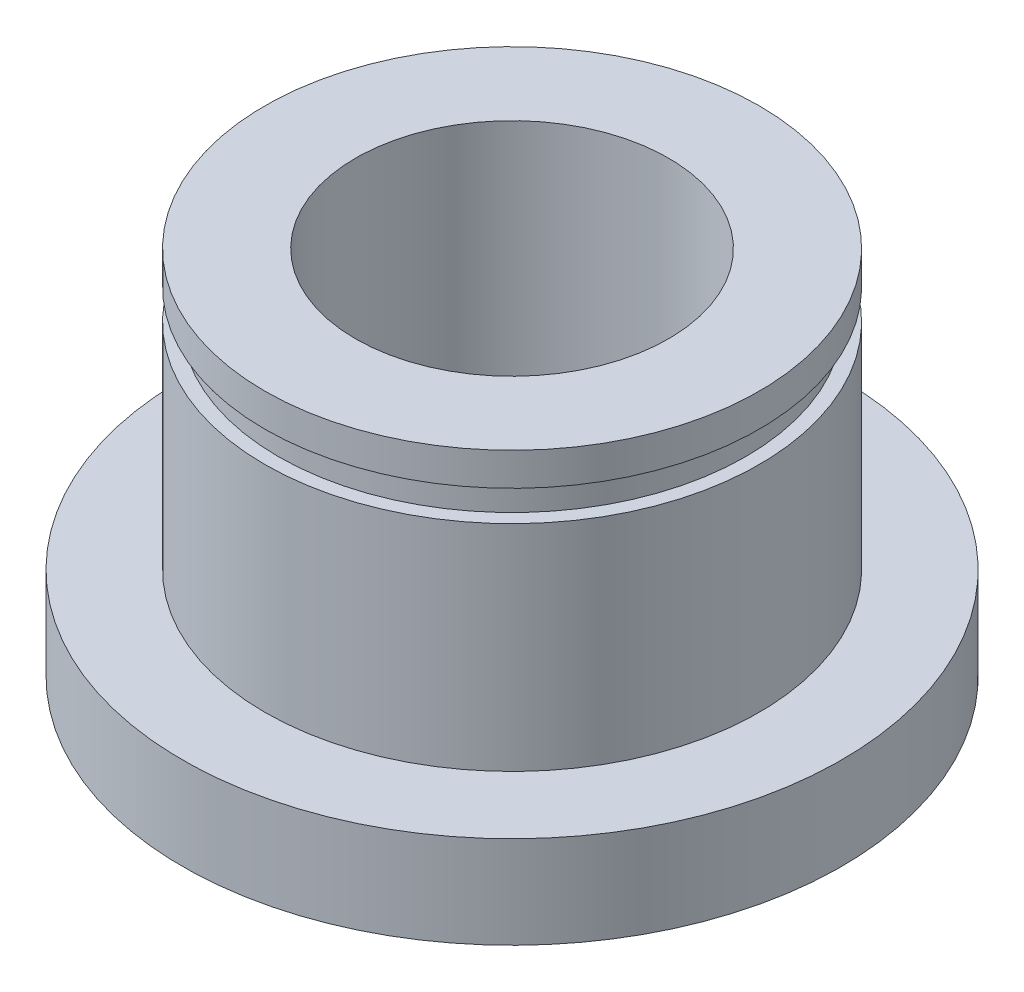
ISO-10303-21;
HEADER;
FILE_DESCRIPTION(('STEP AP214'),'2;1');
FILE_NAME('part.step','',(''),(''),'','','');
FILE_SCHEMA(('AUTOMOTIVE_DESIGN { 1 0 10303 214 1 1 1 1 }'));
ENDSEC;
DATA;
#1=APPLICATION_CONTEXT('core data for automotive mechanical design processes');
#2=APPLICATION_PROTOCOL_DEFINITION('international standard','automotive_design',2000,#1);
#3=PRODUCT_CONTEXT('',#1,'mechanical');
#4=PRODUCT('Part','Part','',(#3));
#5=PRODUCT_RELATED_PRODUCT_CATEGORY('part','',(#4));
#6=PRODUCT_DEFINITION_FORMATION('','',#4);
#7=PRODUCT_DEFINITION_CONTEXT('part definition',#1,'design');
#8=PRODUCT_DEFINITION('design','',#6,#7);
#9=PRODUCT_DEFINITION_SHAPE('','',#8);
#10=(LENGTH_UNIT() NAMED_UNIT(*) SI_UNIT(.MILLI.,.METRE.));
#11=(NAMED_UNIT(*) PLANE_ANGLE_UNIT() SI_UNIT($,.RADIAN.));
#12=(NAMED_UNIT(*) SI_UNIT($,.STERADIAN.) SOLID_ANGLE_UNIT());
#13=UNCERTAINTY_MEASURE_WITH_UNIT(LENGTH_MEASURE(1.E-05),#10,'distance_accuracy_value','');
#14=(GEOMETRIC_REPRESENTATION_CONTEXT(3) GLOBAL_UNCERTAINTY_ASSIGNED_CONTEXT((#13)) GLOBAL_UNIT_ASSIGNED_CONTEXT((#10,
#11,#12)) REPRESENTATION_CONTEXT('',''));
#15=CARTESIAN_POINT('',(0.,0.,0.));
#16=DIRECTION('',(0.,0.,1.));
#17=DIRECTION('',(1.,0.,0.));
#18=AXIS2_PLACEMENT_3D('',#15,#16,#17);
#19=CARTESIAN_POINT('',(0.,-4.460875,0.));
#20=DIRECTION('',(0.,1.,0.));
#21=DIRECTION('',(0.,0.,1.));
#22=AXIS2_PLACEMENT_3D('',#19,#20,#21);
#23=PLANE('',#22);
#24=CARTESIAN_POINT('',(0.,-4.460875,0.));
#25=DIRECTION('',(0.,1.,0.));
#26=DIRECTION('',(0.,0.,1.));
#27=AXIS2_PLACEMENT_3D('',#24,#25,#26);
#28=CIRCLE('',#27,4.564126);
#29=CARTESIAN_POINT('',(0.,-4.460875,4.564126));
#30=VERTEX_POINT('',#29);
#31=EDGE_CURVE('E50',#30,#30,#28,.T.);
#32=ORIENTED_EDGE('',*,*,#31,.T.);
#33=EDGE_LOOP('',(#32));
#34=FACE_BOUND('',#33,.T.);
#35=CARTESIAN_POINT('',(0.,-4.460875,0.));
#36=DIRECTION('',(0.,-1.,0.));
#37=DIRECTION('',(0.,0.,-1.));
#38=AXIS2_PLACEMENT_3D('',#35,#36,#37);
#39=CIRCLE('',#38,7.9375);
#40=CARTESIAN_POINT('',(0.,-4.460875,-7.9375));
#41=VERTEX_POINT('',#40);
#42=EDGE_CURVE('E56',#41,#41,#39,.T.);
#43=ORIENTED_EDGE('',*,*,#42,.T.);
#44=EDGE_LOOP('',(#43));
#45=FACE_BOUND('',#44,.T.);
#46=ADVANCED_FACE('F42',(#34,#45),#23,.F.);
#47=CARTESIAN_POINT('',(0.,0.,0.));
#48=DIRECTION('',(0.,-1.,0.));
#49=DIRECTION('',(0.,0.,-1.));
#50=AXIS2_PLACEMENT_3D('',#47,#48,#49);
#51=CYLINDRICAL_SURFACE('',#50,7.9375);
#52=ORIENTED_EDGE('',*,*,#42,.F.);
#53=EDGE_LOOP('',(#52));
#54=FACE_BOUND('',#53,.T.);
#55=CARTESIAN_POINT('',(0.,-2.238375,0.));
#56=DIRECTION('',(0.,-1.,0.));
#57=DIRECTION('',(0.,0.,-1.));
#58=AXIS2_PLACEMENT_3D('',#55,#56,#57);
#59=CIRCLE('',#58,7.9375);
#60=CARTESIAN_POINT('',(0.,-2.238375,-7.9375));
#61=VERTEX_POINT('',#60);
#62=EDGE_CURVE('E62',#61,#61,#59,.T.);
#63=ORIENTED_EDGE('',*,*,#62,.T.);
#64=EDGE_LOOP('',(#63));
#65=FACE_BOUND('',#64,.T.);
#66=ADVANCED_FACE('F119',(#54,#65),#51,.T.);
#67=CARTESIAN_POINT('',(0.,-2.238375,7.9375));
#68=DIRECTION('',(0.,-1.,0.));
#69=DIRECTION('',(0.,0.,-1.));
#70=AXIS2_PLACEMENT_3D('',#67,#68,#69);
#71=PLANE('',#70);
#72=ORIENTED_EDGE('',*,*,#62,.F.);
#73=EDGE_LOOP('',(#72));
#74=FACE_BOUND('',#73,.T.);
#75=CARTESIAN_POINT('',(0.,-2.238375,0.));
#76=DIRECTION('',(0.,-1.,0.));
#77=DIRECTION('',(0.,0.,-1.));
#78=AXIS2_PLACEMENT_3D('',#75,#76,#77);
#79=CIRCLE('',#78,5.953125);
#80=CARTESIAN_POINT('',(0.,-2.238375,-5.953125));
#81=VERTEX_POINT('',#80);
#82=EDGE_CURVE('E68',#81,#81,#79,.T.);
#83=ORIENTED_EDGE('',*,*,#82,.T.);
#84=EDGE_LOOP('',(#83));
#85=FACE_BOUND('',#84,.T.);
#86=ADVANCED_FACE('F123',(#74,#85),#71,.F.);
#87=CARTESIAN_POINT('',(0.,0.,0.));
#88=DIRECTION('',(0.,-1.,0.));
#89=DIRECTION('',(0.,0.,-1.));
#90=AXIS2_PLACEMENT_3D('',#87,#88,#89);
#91=CYLINDRICAL_SURFACE('',#90,5.953125);
#92=ORIENTED_EDGE('',*,*,#82,.F.);
#93=EDGE_LOOP('',(#92));
#94=FACE_BOUND('',#93,.T.);
#95=CARTESIAN_POINT('',(0.,2.930525,0.));
#96=DIRECTION('',(0.,-1.,0.));
#97=DIRECTION('',(0.,0.,-1.));
#98=AXIS2_PLACEMENT_3D('',#95,#96,#97);
#99=CIRCLE('',#98,5.953125);
#100=CARTESIAN_POINT('',(0.,2.930525,-5.953125));
#101=VERTEX_POINT('',#100);
#102=EDGE_CURVE('E72',#101,#101,#99,.T.);
#103=ORIENTED_EDGE('',*,*,#102,.T.);
#104=EDGE_LOOP('',(#103));
#105=FACE_BOUND('',#104,.T.);
#106=ADVANCED_FACE('F130',(#94,#105),#91,.T.);
#107=CARTESIAN_POINT('',(0.,2.930525,5.953125));
#108=DIRECTION('',(0.,-1.,0.));
#109=DIRECTION('',(0.,0.,-1.));
#110=AXIS2_PLACEMENT_3D('',#107,#108,#109);
#111=PLANE('',#110);
#112=ORIENTED_EDGE('',*,*,#102,.F.);
#113=EDGE_LOOP('',(#112));
#114=FACE_BOUND('',#113,.T.);
#115=CARTESIAN_POINT('',(0.,2.930525,0.));
#116=DIRECTION('',(0.,-1.,0.));
#117=DIRECTION('',(0.,0.,-1.));
#118=AXIS2_PLACEMENT_3D('',#115,#116,#117);
#119=CIRCLE('',#118,5.6261);
#120=CARTESIAN_POINT('',(0.,2.930525,-5.6261));
#121=VERTEX_POINT('',#120);
#122=EDGE_CURVE('E76',#121,#121,#119,.T.);
#123=ORIENTED_EDGE('',*,*,#122,.T.);
#124=EDGE_LOOP('',(#123));
#125=FACE_BOUND('',#124,.T.);
#126=ADVANCED_FACE('F134',(#114,#125),#111,.F.);
#127=CARTESIAN_POINT('',(0.,0.,0.));
#128=DIRECTION('',(0.,-1.,0.));
#129=DIRECTION('',(0.,0.,-1.));
#130=AXIS2_PLACEMENT_3D('',#127,#128,#129);
#131=CYLINDRICAL_SURFACE('',#130,5.6261);
#132=ORIENTED_EDGE('',*,*,#122,.F.);
#133=EDGE_LOOP('',(#132));
#134=FACE_BOUND('',#133,.T.);
#135=CARTESIAN_POINT('',(0.,3.667125,0.));
#136=DIRECTION('',(0.,-1.,0.));
#137=DIRECTION('',(0.,0.,-1.));
#138=AXIS2_PLACEMENT_3D('',#135,#136,#137);
#139=CIRCLE('',#138,5.6261);
#140=CARTESIAN_POINT('',(0.,3.667125,-5.6261));
#141=VERTEX_POINT('',#140);
#142=EDGE_CURVE('E80',#141,#141,#139,.T.);
#143=ORIENTED_EDGE('',*,*,#142,.T.);
#144=EDGE_LOOP('',(#143));
#145=FACE_BOUND('',#144,.T.);
#146=ADVANCED_FACE('F114',(#134,#145),#131,.T.);
#147=CARTESIAN_POINT('',(0.,3.667125,5.6261));
#148=DIRECTION('',(0.,1.,0.));
#149=DIRECTION('',(0.,0.,1.));
#150=AXIS2_PLACEMENT_3D('',#147,#148,#149);
#151=PLANE('',#150);
#152=ORIENTED_EDGE('',*,*,#142,.F.);
#153=EDGE_LOOP('',(#152));
#154=FACE_BOUND('',#153,.T.);
#155=CARTESIAN_POINT('',(0.,3.667125,0.));
#156=DIRECTION('',(0.,-1.,0.));
#157=DIRECTION('',(0.,0.,-1.));
#158=AXIS2_PLACEMENT_3D('',#155,#156,#157);
#159=CIRCLE('',#158,5.953125);
#160=CARTESIAN_POINT('',(0.,3.667125,-5.953125));
#161=VERTEX_POINT('',#160);
#162=EDGE_CURVE('E84',#161,#161,#159,.T.);
#163=ORIENTED_EDGE('',*,*,#162,.T.);
#164=EDGE_LOOP('',(#163));
#165=FACE_BOUND('',#164,.T.);
#166=ADVANCED_FACE('F108',(#154,#165),#151,.F.);
#167=CARTESIAN_POINT('',(0.,0.,0.));
#168=DIRECTION('',(0.,-1.,0.));
#169=DIRECTION('',(0.,0.,-1.));
#170=AXIS2_PLACEMENT_3D('',#167,#168,#169);
#171=CYLINDRICAL_SURFACE('',#170,5.953125);
#172=ORIENTED_EDGE('',*,*,#162,.F.);
#173=EDGE_LOOP('',(#172));
#174=FACE_BOUND('',#173,.T.);
#175=CARTESIAN_POINT('',(0.,4.460875,0.));
#176=DIRECTION('',(0.,-1.,0.));
#177=DIRECTION('',(0.,0.,-1.));
#178=AXIS2_PLACEMENT_3D('',#175,#176,#177);
#179=CIRCLE('',#178,5.953125);
#180=CARTESIAN_POINT('',(0.,4.460875,-5.953125));
#181=VERTEX_POINT('',#180);
#182=EDGE_CURVE('E88',#181,#181,#179,.T.);
#183=ORIENTED_EDGE('',*,*,#182,.T.);
#184=EDGE_LOOP('',(#183));
#185=FACE_BOUND('',#184,.T.);
#186=ADVANCED_FACE('F103',(#174,#185),#171,.T.);
#187=CARTESIAN_POINT('',(0.,4.460875,5.953125));
#188=DIRECTION('',(0.,-1.,0.));
#189=DIRECTION('',(0.,0.,-1.));
#190=AXIS2_PLACEMENT_3D('',#187,#188,#189);
#191=PLANE('',#190);
#192=CARTESIAN_POINT('',(0.,4.460875,0.));
#193=DIRECTION('',(0.,1.,0.));
#194=DIRECTION('',(0.,0.,1.));
#195=AXIS2_PLACEMENT_3D('',#192,#193,#194);
#196=CIRCLE('',#195,3.77037599999999);
#197=CARTESIAN_POINT('',(0.,4.460875,3.77037599999999));
#198=VERTEX_POINT('',#197);
#199=EDGE_CURVE('E92',#198,#198,#196,.T.);
#200=ORIENTED_EDGE('',*,*,#199,.F.);
#201=EDGE_LOOP('',(#200));
#202=FACE_BOUND('',#201,.T.);
#203=ORIENTED_EDGE('',*,*,#182,.F.);
#204=EDGE_LOOP('',(#203));
#205=FACE_BOUND('',#204,.T.);
#206=ADVANCED_FACE('F100',(#202,#205),#191,.F.);
#207=CARTESIAN_POINT('',(0.,4.460875,0.));
#208=DIRECTION('',(0.,1.,0.));
#209=DIRECTION('',(0.,0.,1.));
#210=AXIS2_PLACEMENT_3D('',#207,#208,#209);
#211=CYLINDRICAL_SURFACE('',#210,3.77037599999999);
#212=CARTESIAN_POINT('',(0.,-3.66712499999999,0.));
#213=DIRECTION('',(0.,1.,0.));
#214=DIRECTION('',(0.,0.,1.));
#215=AXIS2_PLACEMENT_3D('',#212,#213,#214);
#216=CIRCLE('',#215,3.77037599999999);
#217=CARTESIAN_POINT('',(0.,-3.66712499999999,3.77037599999999));
#218=VERTEX_POINT('',#217);
#219=EDGE_CURVE('E10',#218,#218,#216,.F.);
#220=ORIENTED_EDGE('',*,*,#219,.T.);
#221=EDGE_LOOP('',(#220));
#222=FACE_BOUND('',#221,.T.);
#223=ORIENTED_EDGE('',*,*,#199,.T.);
#224=EDGE_LOOP('',(#223));
#225=FACE_BOUND('',#224,.T.);
#226=ADVANCED_FACE('F98',(#222,#225),#211,.F.);
#227=CARTESIAN_POINT('',(0.,-4.460875,0.));
#228=DIRECTION('',(0.,-1.,0.));
#229=DIRECTION('',(0.,0.,-1.));
#230=AXIS2_PLACEMENT_3D('',#227,#228,#229);
#231=CONICAL_SURFACE('',#230,4.564126,0.785398163397447);
#232=ORIENTED_EDGE('',*,*,#219,.F.);
#233=EDGE_LOOP('',(#232));
#234=FACE_BOUND('',#233,.T.);
#235=ORIENTED_EDGE('',*,*,#31,.F.);
#236=EDGE_LOOP('',(#235));
#237=FACE_BOUND('',#236,.T.);
#238=ADVANCED_FACE('F44',(#234,#237),#231,.F.);
#239=CLOSED_SHELL('',(#46,#66,#86,#106,#126,#146,#166,#186,#206,#226,#238));
#240=MANIFOLD_SOLID_BREP('B2',#239);
#241=ADVANCED_BREP_SHAPE_REPRESENTATION('',(#18,#240),#14);
#242=SHAPE_DEFINITION_REPRESENTATION(#9,#241);
ENDSEC;
END-ISO-10303-21;
